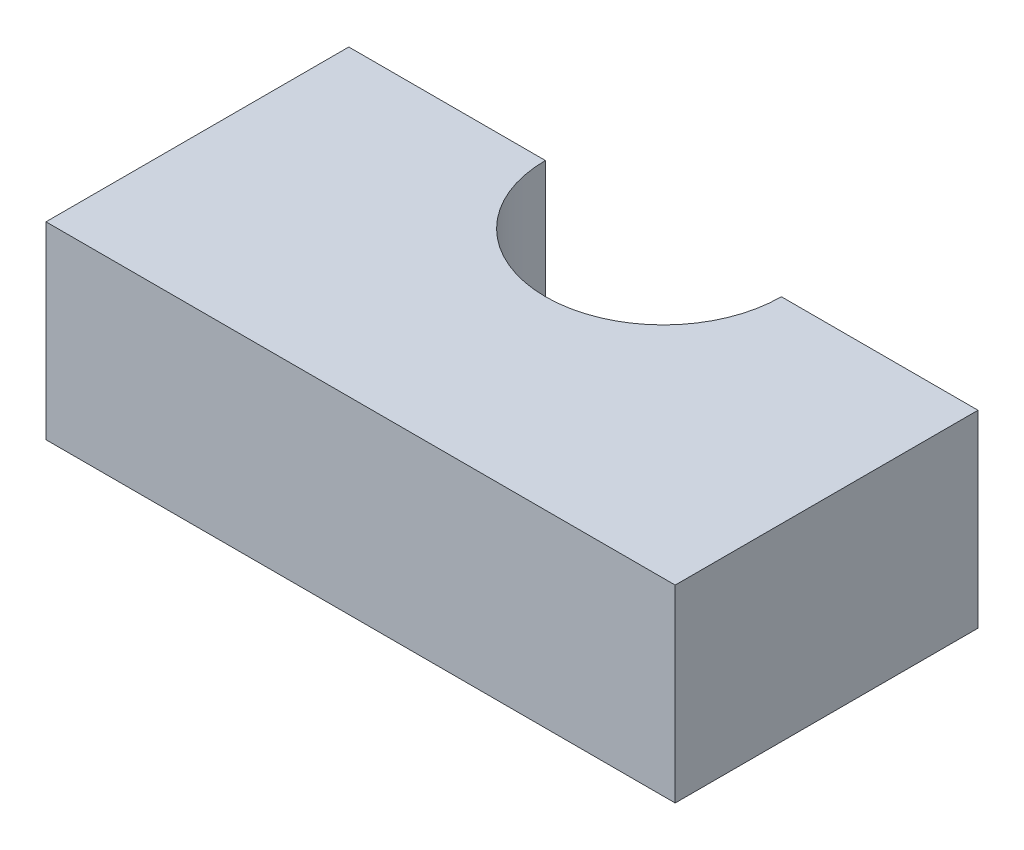
ISO-10303-21;
HEADER;
FILE_DESCRIPTION(('STEP AP214'),'2;1');
FILE_NAME('part.step','',(''),(''),'','','');
FILE_SCHEMA(('AUTOMOTIVE_DESIGN { 1 0 10303 214 1 1 1 1 }'));
ENDSEC;
DATA;
#1=APPLICATION_CONTEXT('core data for automotive mechanical design processes');
#2=APPLICATION_PROTOCOL_DEFINITION('international standard','automotive_design',2000,#1);
#3=PRODUCT_CONTEXT('',#1,'mechanical');
#4=PRODUCT('Part','Part','',(#3));
#5=PRODUCT_RELATED_PRODUCT_CATEGORY('part','',(#4));
#6=PRODUCT_DEFINITION_FORMATION('','',#4);
#7=PRODUCT_DEFINITION_CONTEXT('part definition',#1,'design');
#8=PRODUCT_DEFINITION('design','',#6,#7);
#9=PRODUCT_DEFINITION_SHAPE('','',#8);
#10=(LENGTH_UNIT() NAMED_UNIT(*) SI_UNIT(.MILLI.,.METRE.));
#11=(NAMED_UNIT(*) PLANE_ANGLE_UNIT() SI_UNIT($,.RADIAN.));
#12=(NAMED_UNIT(*) SI_UNIT($,.STERADIAN.) SOLID_ANGLE_UNIT());
#13=UNCERTAINTY_MEASURE_WITH_UNIT(LENGTH_MEASURE(1.E-05),#10,'distance_accuracy_value','');
#14=(GEOMETRIC_REPRESENTATION_CONTEXT(3) GLOBAL_UNCERTAINTY_ASSIGNED_CONTEXT((#13)) GLOBAL_UNIT_ASSIGNED_CONTEXT((#10,
#11,#12)) REPRESENTATION_CONTEXT('',''));
#15=CARTESIAN_POINT('',(0.,0.,0.));
#16=DIRECTION('',(0.,0.,1.));
#17=DIRECTION('',(1.,0.,0.));
#18=AXIS2_PLACEMENT_3D('',#15,#16,#17);
#19=CARTESIAN_POINT('',(-0.8,0.48,-0.385));
#20=DIRECTION('',(0.,0.,1.));
#21=DIRECTION('',(1.,0.,0.));
#22=AXIS2_PLACEMENT_3D('',#19,#20,#21);
#23=PLANE('',#22);
#24=DIRECTION('',(-1.,0.,0.));
#25=VECTOR('',#24,1.);
#26=CARTESIAN_POINT('',(-0.8,0.,-0.385));
#27=LINE('',#26,#25);
#28=CARTESIAN_POINT('',(0.8,0.,-0.385));
#29=VERTEX_POINT('',#28);
#30=CARTESIAN_POINT('',(0.3,0.,-0.385));
#31=VERTEX_POINT('',#30);
#32=EDGE_CURVE('E120',#29,#31,#27,.T.);
#33=ORIENTED_EDGE('',*,*,#32,.T.);
#34=DIRECTION('',(0.,1.,0.));
#35=VECTOR('',#34,1.);
#36=CARTESIAN_POINT('',(0.3,0.,-0.385));
#37=LINE('',#36,#35);
#38=CARTESIAN_POINT('',(0.3,0.48,-0.385));
#39=VERTEX_POINT('',#38);
#40=EDGE_CURVE('E55',#31,#39,#37,.T.);
#41=ORIENTED_EDGE('',*,*,#40,.T.);
#42=DIRECTION('',(-1.,0.,0.));
#43=VECTOR('',#42,1.);
#44=CARTESIAN_POINT('',(-0.8,0.48,-0.385));
#45=LINE('',#44,#43);
#46=CARTESIAN_POINT('',(0.8,0.48,-0.385));
#47=VERTEX_POINT('',#46);
#48=EDGE_CURVE('E91',#47,#39,#45,.T.);
#49=ORIENTED_EDGE('',*,*,#48,.F.);
#50=DIRECTION('',(0.,-1.,0.));
#51=VECTOR('',#50,1.);
#52=CARTESIAN_POINT('',(0.8,0.48,-0.385));
#53=LINE('',#52,#51);
#54=EDGE_CURVE('E48',#47,#29,#53,.T.);
#55=ORIENTED_EDGE('',*,*,#54,.T.);
#56=EDGE_LOOP('',(#33,#41,#49,#55));
#57=FACE_BOUND('',#56,.T.);
#58=ADVANCED_FACE('F39',(#57),#23,.F.);
#59=CARTESIAN_POINT('',(0.8,0.48,-0.385));
#60=DIRECTION('',(-1.,0.,0.));
#61=DIRECTION('',(0.,0.,1.));
#62=AXIS2_PLACEMENT_3D('',#59,#60,#61);
#63=PLANE('',#62);
#64=DIRECTION('',(0.,0.,-1.));
#65=VECTOR('',#64,1.);
#66=CARTESIAN_POINT('',(0.8,0.,-0.385));
#67=LINE('',#66,#65);
#68=CARTESIAN_POINT('',(0.8,0.,0.385));
#69=VERTEX_POINT('',#68);
#70=EDGE_CURVE('E121',#69,#29,#67,.T.);
#71=ORIENTED_EDGE('',*,*,#70,.T.);
#72=ORIENTED_EDGE('',*,*,#54,.F.);
#73=DIRECTION('',(0.,0.,-1.));
#74=VECTOR('',#73,1.);
#75=CARTESIAN_POINT('',(0.8,0.48,-0.385));
#76=LINE('',#75,#74);
#77=CARTESIAN_POINT('',(0.8,0.48,0.385));
#78=VERTEX_POINT('',#77);
#79=EDGE_CURVE('E133',#78,#47,#76,.T.);
#80=ORIENTED_EDGE('',*,*,#79,.F.);
#81=DIRECTION('',(0.,-1.,0.));
#82=VECTOR('',#81,1.);
#83=CARTESIAN_POINT('',(0.8,0.48,0.385));
#84=LINE('',#83,#82);
#85=EDGE_CURVE('E134',#78,#69,#84,.T.);
#86=ORIENTED_EDGE('',*,*,#85,.T.);
#87=EDGE_LOOP('',(#71,#72,#80,#86));
#88=FACE_BOUND('',#87,.T.);
#89=ADVANCED_FACE('F41',(#88),#63,.F.);
#90=CARTESIAN_POINT('',(-0.3,0.48,-0.385));
#91=VERTEX_POINT('',#90);
#92=CARTESIAN_POINT('',(-0.8,0.48,-0.385));
#93=VERTEX_POINT('',#92);
#94=EDGE_CURVE('E112',#91,#93,#45,.T.);
#95=ORIENTED_EDGE('',*,*,#94,.F.);
#96=DIRECTION('',(0.,1.,0.));
#97=VECTOR('',#96,1.);
#98=CARTESIAN_POINT('',(-0.3,0.,-0.385));
#99=LINE('',#98,#97);
#100=CARTESIAN_POINT('',(-0.3,0.,-0.385));
#101=VERTEX_POINT('',#100);
#102=EDGE_CURVE('E101',#91,#101,#99,.F.);
#103=ORIENTED_EDGE('',*,*,#102,.T.);
#104=CARTESIAN_POINT('',(-0.8,0.,-0.385));
#105=VERTEX_POINT('',#104);
#106=EDGE_CURVE('E110',#101,#105,#27,.T.);
#107=ORIENTED_EDGE('',*,*,#106,.T.);
#108=DIRECTION('',(0.,-1.,0.));
#109=VECTOR('',#108,1.);
#110=CARTESIAN_POINT('',(-0.8,0.48,-0.385));
#111=LINE('',#110,#109);
#112=EDGE_CURVE('E140',#93,#105,#111,.T.);
#113=ORIENTED_EDGE('',*,*,#112,.F.);
#114=EDGE_LOOP('',(#95,#103,#107,#113));
#115=FACE_BOUND('',#114,.T.);
#116=ADVANCED_FACE('F108',(#115),#23,.F.);
#117=CARTESIAN_POINT('',(-0.8,0.48,-0.385));
#118=DIRECTION('',(1.,0.,0.));
#119=DIRECTION('',(0.,0.,-1.));
#120=AXIS2_PLACEMENT_3D('',#117,#118,#119);
#121=PLANE('',#120);
#122=DIRECTION('',(0.,0.,1.));
#123=VECTOR('',#122,1.);
#124=CARTESIAN_POINT('',(-0.8,0.,-0.385));
#125=LINE('',#124,#123);
#126=CARTESIAN_POINT('',(-0.8,0.,0.385));
#127=VERTEX_POINT('',#126);
#128=EDGE_CURVE('E118',#105,#127,#125,.T.);
#129=ORIENTED_EDGE('',*,*,#128,.T.);
#130=DIRECTION('',(0.,-1.,0.));
#131=VECTOR('',#130,1.);
#132=CARTESIAN_POINT('',(-0.8,0.48,0.385));
#133=LINE('',#132,#131);
#134=CARTESIAN_POINT('',(-0.8,0.48,0.385));
#135=VERTEX_POINT('',#134);
#136=EDGE_CURVE('E137',#135,#127,#133,.T.);
#137=ORIENTED_EDGE('',*,*,#136,.F.);
#138=DIRECTION('',(0.,0.,1.));
#139=VECTOR('',#138,1.);
#140=CARTESIAN_POINT('',(-0.8,0.48,-0.385));
#141=LINE('',#140,#139);
#142=EDGE_CURVE('E150',#93,#135,#141,.T.);
#143=ORIENTED_EDGE('',*,*,#142,.F.);
#144=ORIENTED_EDGE('',*,*,#112,.T.);
#145=EDGE_LOOP('',(#129,#137,#143,#144));
#146=FACE_BOUND('',#145,.T.);
#147=ADVANCED_FACE('F169',(#146),#121,.F.);
#148=CARTESIAN_POINT('',(-0.8,0.48,0.385));
#149=DIRECTION('',(0.,0.,-1.));
#150=DIRECTION('',(-1.,0.,0.));
#151=AXIS2_PLACEMENT_3D('',#148,#149,#150);
#152=PLANE('',#151);
#153=DIRECTION('',(1.,0.,0.));
#154=VECTOR('',#153,1.);
#155=CARTESIAN_POINT('',(-0.8,0.,0.385));
#156=LINE('',#155,#154);
#157=EDGE_CURVE('E84',#127,#69,#156,.T.);
#158=ORIENTED_EDGE('',*,*,#157,.T.);
#159=ORIENTED_EDGE('',*,*,#85,.F.);
#160=DIRECTION('',(1.,0.,0.));
#161=VECTOR('',#160,1.);
#162=CARTESIAN_POINT('',(-0.8,0.48,0.385));
#163=LINE('',#162,#161);
#164=EDGE_CURVE('E63',#135,#78,#163,.T.);
#165=ORIENTED_EDGE('',*,*,#164,.F.);
#166=ORIENTED_EDGE('',*,*,#136,.T.);
#167=EDGE_LOOP('',(#158,#159,#165,#166));
#168=FACE_BOUND('',#167,.T.);
#169=ADVANCED_FACE('F147',(#168),#152,.F.);
#170=CARTESIAN_POINT('',(0.,0.48,0.));
#171=DIRECTION('',(0.,1.,0.));
#172=DIRECTION('',(0.,0.,1.));
#173=AXIS2_PLACEMENT_3D('',#170,#171,#172);
#174=PLANE('',#173);
#175=CARTESIAN_POINT('',(0.,0.48,-0.385));
#176=DIRECTION('',(0.,1.,0.));
#177=DIRECTION('',(0.,0.,1.));
#178=AXIS2_PLACEMENT_3D('',#175,#176,#177);
#179=CIRCLE('',#178,0.3);
#180=EDGE_CURVE('E114',#91,#39,#179,.T.);
#181=ORIENTED_EDGE('',*,*,#180,.F.);
#182=ORIENTED_EDGE('',*,*,#94,.T.);
#183=ORIENTED_EDGE('',*,*,#142,.T.);
#184=ORIENTED_EDGE('',*,*,#164,.T.);
#185=ORIENTED_EDGE('',*,*,#79,.T.);
#186=ORIENTED_EDGE('',*,*,#48,.T.);
#187=EDGE_LOOP('',(#181,#182,#183,#184,#185,#186));
#188=FACE_BOUND('',#187,.T.);
#189=ADVANCED_FACE('F161',(#188),#174,.T.);
#190=CARTESIAN_POINT('',(0.,0.,0.));
#191=DIRECTION('',(0.,1.,0.));
#192=DIRECTION('',(0.,0.,1.));
#193=AXIS2_PLACEMENT_3D('',#190,#191,#192);
#194=PLANE('',#193);
#195=ORIENTED_EDGE('',*,*,#106,.F.);
#196=CARTESIAN_POINT('',(0.,0.,-0.385));
#197=DIRECTION('',(0.,1.,0.));
#198=DIRECTION('',(0.,0.,1.));
#199=AXIS2_PLACEMENT_3D('',#196,#197,#198);
#200=CIRCLE('',#199,0.3);
#201=EDGE_CURVE('E11',#101,#31,#200,.T.);
#202=ORIENTED_EDGE('',*,*,#201,.T.);
#203=ORIENTED_EDGE('',*,*,#32,.F.);
#204=ORIENTED_EDGE('',*,*,#70,.F.);
#205=ORIENTED_EDGE('',*,*,#157,.F.);
#206=ORIENTED_EDGE('',*,*,#128,.F.);
#207=EDGE_LOOP('',(#195,#202,#203,#204,#205,#206));
#208=FACE_BOUND('',#207,.T.);
#209=ADVANCED_FACE('F117',(#208),#194,.F.);
#210=CARTESIAN_POINT('',(0.,0.,-0.385));
#211=DIRECTION('',(0.,1.,0.));
#212=DIRECTION('',(0.,0.,1.));
#213=AXIS2_PLACEMENT_3D('',#210,#211,#212);
#214=CYLINDRICAL_SURFACE('',#213,0.3);
#215=ORIENTED_EDGE('',*,*,#201,.F.);
#216=ORIENTED_EDGE('',*,*,#102,.F.);
#217=ORIENTED_EDGE('',*,*,#180,.T.);
#218=ORIENTED_EDGE('',*,*,#40,.F.);
#219=EDGE_LOOP('',(#215,#216,#217,#218));
#220=FACE_BOUND('',#219,.T.);
#221=ADVANCED_FACE('F100',(#220),#214,.F.);
#222=CLOSED_SHELL('',(#58,#89,#116,#147,#169,#189,#209,#221));
#223=MANIFOLD_SOLID_BREP('B2',#222);
#224=ADVANCED_BREP_SHAPE_REPRESENTATION('',(#18,#223),#14);
#225=SHAPE_DEFINITION_REPRESENTATION(#9,#224);
ENDSEC;
END-ISO-10303-21;
